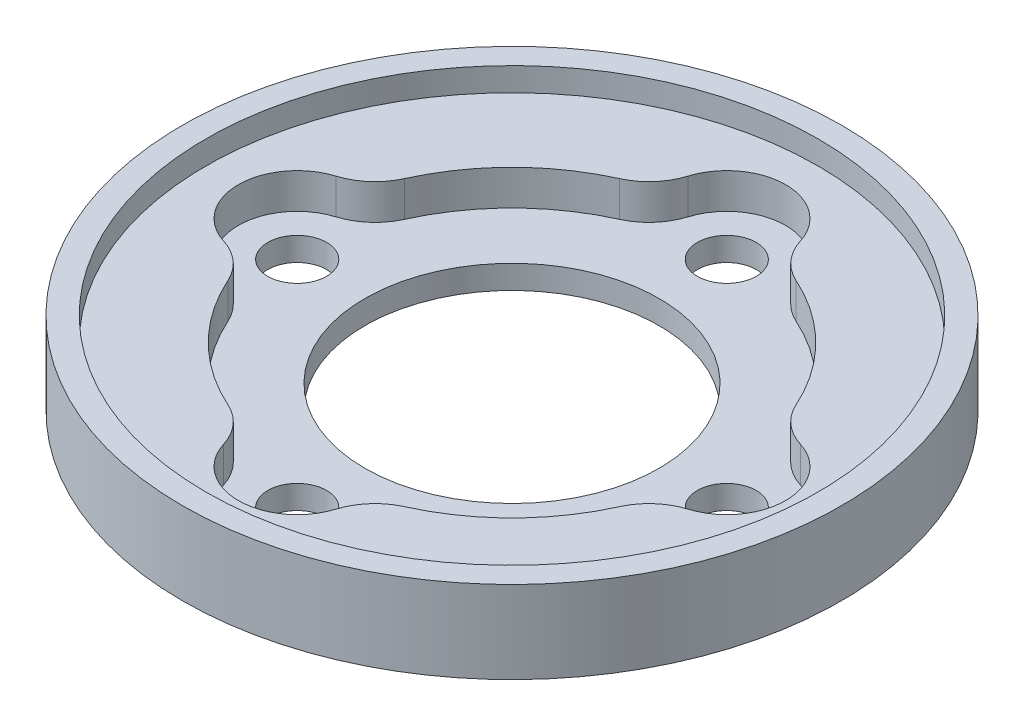
ISO-10303-21;
HEADER;
FILE_DESCRIPTION(('STEP AP214'),'2;1');
FILE_NAME('part.step','',(''),(''),'','','');
FILE_SCHEMA(('AUTOMOTIVE_DESIGN { 1 0 10303 214 1 1 1 1 }'));
ENDSEC;
DATA;
#1=APPLICATION_CONTEXT('core data for automotive mechanical design processes');
#2=APPLICATION_PROTOCOL_DEFINITION('international standard','automotive_design',2000,#1);
#3=PRODUCT_CONTEXT('',#1,'mechanical');
#4=PRODUCT('Part','Part','',(#3));
#5=PRODUCT_RELATED_PRODUCT_CATEGORY('part','',(#4));
#6=PRODUCT_DEFINITION_FORMATION('','',#4);
#7=PRODUCT_DEFINITION_CONTEXT('part definition',#1,'design');
#8=PRODUCT_DEFINITION('design','',#6,#7);
#9=PRODUCT_DEFINITION_SHAPE('','',#8);
#10=(LENGTH_UNIT() NAMED_UNIT(*) SI_UNIT(.MILLI.,.METRE.));
#11=(NAMED_UNIT(*) PLANE_ANGLE_UNIT() SI_UNIT($,.RADIAN.));
#12=(NAMED_UNIT(*) SI_UNIT($,.STERADIAN.) SOLID_ANGLE_UNIT());
#13=UNCERTAINTY_MEASURE_WITH_UNIT(LENGTH_MEASURE(1.E-05),#10,'distance_accuracy_value','');
#14=(GEOMETRIC_REPRESENTATION_CONTEXT(3) GLOBAL_UNCERTAINTY_ASSIGNED_CONTEXT((#13)) GLOBAL_UNIT_ASSIGNED_CONTEXT((#10,
#11,#12)) REPRESENTATION_CONTEXT('',''));
#15=CARTESIAN_POINT('',(0.,0.,0.));
#16=DIRECTION('',(0.,0.,1.));
#17=DIRECTION('',(1.,0.,0.));
#18=AXIS2_PLACEMENT_3D('',#15,#16,#17);
#19=CARTESIAN_POINT('',(0.,5.,0.));
#20=DIRECTION('',(0.,-1.,0.));
#21=DIRECTION('',(0.,0.,-1.));
#22=AXIS2_PLACEMENT_3D('',#19,#20,#21);
#23=CYLINDRICAL_SURFACE('',#22,12.5);
#24=CARTESIAN_POINT('',(0.,0.,0.));
#25=DIRECTION('',(0.,1.,0.));
#26=DIRECTION('',(0.,0.,1.));
#27=AXIS2_PLACEMENT_3D('',#24,#25,#26);
#28=CIRCLE('',#27,12.5);
#29=CARTESIAN_POINT('',(0.,0.,12.5));
#30=VERTEX_POINT('',#29);
#31=EDGE_CURVE('E255',#30,#30,#28,.T.);
#32=ORIENTED_EDGE('',*,*,#31,.F.);
#33=EDGE_LOOP('',(#32));
#34=FACE_BOUND('',#33,.T.);
#35=CARTESIAN_POINT('',(0.,2.,0.));
#36=DIRECTION('',(0.,1.,0.));
#37=DIRECTION('',(0.,0.,1.));
#38=AXIS2_PLACEMENT_3D('',#35,#36,#37);
#39=CIRCLE('',#38,12.5);
#40=CARTESIAN_POINT('',(0.,2.,12.5));
#41=VERTEX_POINT('',#40);
#42=EDGE_CURVE('E227',#41,#41,#39,.T.);
#43=ORIENTED_EDGE('',*,*,#42,.T.);
#44=EDGE_LOOP('',(#43));
#45=FACE_BOUND('',#44,.T.);
#46=ADVANCED_FACE('F39',(#34,#45),#23,.F.);
#47=CARTESIAN_POINT('',(18.25,5.,0.));
#48=DIRECTION('',(0.,-1.,0.));
#49=DIRECTION('',(0.,0.,-1.));
#50=AXIS2_PLACEMENT_3D('',#47,#48,#49);
#51=CYLINDRICAL_SURFACE('',#50,2.5);
#52=CARTESIAN_POINT('',(18.25,0.,0.));
#53=DIRECTION('',(0.,1.,0.));
#54=DIRECTION('',(0.,0.,1.));
#55=AXIS2_PLACEMENT_3D('',#52,#53,#54);
#56=CIRCLE('',#55,2.5);
#57=CARTESIAN_POINT('',(18.25,0.,2.5));
#58=VERTEX_POINT('',#57);
#59=EDGE_CURVE('E251',#58,#58,#56,.T.);
#60=ORIENTED_EDGE('',*,*,#59,.F.);
#61=EDGE_LOOP('',(#60));
#62=FACE_BOUND('',#61,.T.);
#63=CARTESIAN_POINT('',(18.25,2.,0.));
#64=DIRECTION('',(0.,1.,0.));
#65=DIRECTION('',(0.,0.,1.));
#66=AXIS2_PLACEMENT_3D('',#63,#64,#65);
#67=CIRCLE('',#66,2.5);
#68=CARTESIAN_POINT('',(18.25,2.,2.5));
#69=VERTEX_POINT('',#68);
#70=EDGE_CURVE('E223',#69,#69,#67,.T.);
#71=ORIENTED_EDGE('',*,*,#70,.T.);
#72=EDGE_LOOP('',(#71));
#73=FACE_BOUND('',#72,.T.);
#74=ADVANCED_FACE('F445',(#62,#73),#51,.F.);
#75=CARTESIAN_POINT('',(0.,5.,18.25));
#76=DIRECTION('',(0.,-1.,0.));
#77=DIRECTION('',(0.,0.,-1.));
#78=AXIS2_PLACEMENT_3D('',#75,#76,#77);
#79=CYLINDRICAL_SURFACE('',#78,2.5);
#80=CARTESIAN_POINT('',(0.,0.,18.25));
#81=DIRECTION('',(0.,1.,0.));
#82=DIRECTION('',(0.,0.,1.));
#83=AXIS2_PLACEMENT_3D('',#80,#81,#82);
#84=CIRCLE('',#83,2.5);
#85=CARTESIAN_POINT('',(0.,0.,20.75));
#86=VERTEX_POINT('',#85);
#87=EDGE_CURVE('E247',#86,#86,#84,.T.);
#88=ORIENTED_EDGE('',*,*,#87,.F.);
#89=EDGE_LOOP('',(#88));
#90=FACE_BOUND('',#89,.T.);
#91=CARTESIAN_POINT('',(0.,2.,18.25));
#92=DIRECTION('',(0.,1.,0.));
#93=DIRECTION('',(0.,0.,1.));
#94=AXIS2_PLACEMENT_3D('',#91,#92,#93);
#95=CIRCLE('',#94,2.5);
#96=CARTESIAN_POINT('',(0.,2.,20.75));
#97=VERTEX_POINT('',#96);
#98=EDGE_CURVE('E218',#97,#97,#95,.T.);
#99=ORIENTED_EDGE('',*,*,#98,.T.);
#100=EDGE_LOOP('',(#99));
#101=FACE_BOUND('',#100,.T.);
#102=ADVANCED_FACE('F451',(#90,#101),#79,.F.);
#103=CARTESIAN_POINT('',(-18.25,5.,-1.27439068867774E-13));
#104=DIRECTION('',(0.,-1.,0.));
#105=DIRECTION('',(0.,0.,-1.));
#106=AXIS2_PLACEMENT_3D('',#103,#104,#105);
#107=CYLINDRICAL_SURFACE('',#106,2.5);
#108=CARTESIAN_POINT('',(-18.25,0.,-1.27439068867774E-13));
#109=DIRECTION('',(0.,1.,0.));
#110=DIRECTION('',(0.,0.,1.));
#111=AXIS2_PLACEMENT_3D('',#108,#109,#110);
#112=CIRCLE('',#111,2.5);
#113=CARTESIAN_POINT('',(-18.25,0.,2.49999999999987));
#114=VERTEX_POINT('',#113);
#115=EDGE_CURVE('E243',#114,#114,#112,.T.);
#116=ORIENTED_EDGE('',*,*,#115,.F.);
#117=EDGE_LOOP('',(#116));
#118=FACE_BOUND('',#117,.T.);
#119=CARTESIAN_POINT('',(-18.25,2.,-1.27439068867774E-13));
#120=DIRECTION('',(0.,1.,0.));
#121=DIRECTION('',(0.,0.,1.));
#122=AXIS2_PLACEMENT_3D('',#119,#120,#121);
#123=CIRCLE('',#122,2.5);
#124=CARTESIAN_POINT('',(-18.25,2.,2.49999999999987));
#125=VERTEX_POINT('',#124);
#126=EDGE_CURVE('E214',#125,#125,#123,.T.);
#127=ORIENTED_EDGE('',*,*,#126,.T.);
#128=EDGE_LOOP('',(#127));
#129=FACE_BOUND('',#128,.T.);
#130=ADVANCED_FACE('F506',(#118,#129),#107,.F.);
#131=CARTESIAN_POINT('',(1.91158603301662E-13,5.,-18.25));
#132=DIRECTION('',(0.,-1.,0.));
#133=DIRECTION('',(0.,0.,-1.));
#134=AXIS2_PLACEMENT_3D('',#131,#132,#133);
#135=CYLINDRICAL_SURFACE('',#134,2.5);
#136=CARTESIAN_POINT('',(1.91158603301662E-13,0.,-18.25));
#137=DIRECTION('',(0.,1.,0.));
#138=DIRECTION('',(0.,0.,1.));
#139=AXIS2_PLACEMENT_3D('',#136,#137,#138);
#140=CIRCLE('',#139,2.5);
#141=CARTESIAN_POINT('',(1.91158603301662E-13,0.,-15.75));
#142=VERTEX_POINT('',#141);
#143=EDGE_CURVE('E239',#142,#142,#140,.T.);
#144=ORIENTED_EDGE('',*,*,#143,.F.);
#145=EDGE_LOOP('',(#144));
#146=FACE_BOUND('',#145,.T.);
#147=CARTESIAN_POINT('',(1.91158603301662E-13,2.,-18.25));
#148=DIRECTION('',(0.,1.,0.));
#149=DIRECTION('',(0.,0.,1.));
#150=AXIS2_PLACEMENT_3D('',#147,#148,#149);
#151=CIRCLE('',#150,2.5);
#152=CARTESIAN_POINT('',(1.91158603301662E-13,2.,-15.75));
#153=VERTEX_POINT('',#152);
#154=EDGE_CURVE('E219',#153,#153,#151,.T.);
#155=ORIENTED_EDGE('',*,*,#154,.T.);
#156=EDGE_LOOP('',(#155));
#157=FACE_BOUND('',#156,.T.);
#158=ADVANCED_FACE('F461',(#146,#157),#135,.F.);
#159=CARTESIAN_POINT('',(0.,5.,0.));
#160=DIRECTION('',(0.,1.,0.));
#161=DIRECTION('',(0.,0.,1.));
#162=AXIS2_PLACEMENT_3D('',#159,#160,#161);
#163=PLANE('',#162);
#164=CARTESIAN_POINT('',(0.,5.,18.25));
#165=DIRECTION('',(0.,1.,0.));
#166=DIRECTION('',(0.,0.,1.));
#167=AXIS2_PLACEMENT_3D('',#164,#165,#166);
#168=CIRCLE('',#167,5.);
#169=CARTESIAN_POINT('',(-4.77822573461657,5.,19.722602739726));
#170=VERTEX_POINT('',#169);
#171=CARTESIAN_POINT('',(4.77822573461643,5.,19.722602739726));
#172=VERTEX_POINT('',#171);
#173=EDGE_CURVE('E171',#170,#172,#168,.T.);
#174=ORIENTED_EDGE('',*,*,#173,.F.);
#175=CARTESIAN_POINT('',(-9.55645146923308,5.,21.195205479452));
#176=DIRECTION('',(0.,1.,0.));
#177=DIRECTION('',(0.,0.,1.));
#178=AXIS2_PLACEMENT_3D('',#175,#176,#177);
#179=CIRCLE('',#178,5.);
#180=CARTESIAN_POINT('',(-7.50130061563457,5.,16.6370967741935));
#181=VERTEX_POINT('',#180);
#182=EDGE_CURVE('E153',#170,#181,#179,.T.);
#183=ORIENTED_EDGE('',*,*,#182,.T.);
#184=CARTESIAN_POINT('',(0.,5.,0.));
#185=DIRECTION('',(0.,1.,0.));
#186=DIRECTION('',(0.,0.,1.));
#187=AXIS2_PLACEMENT_3D('',#184,#185,#186);
#188=CIRCLE('',#187,18.25);
#189=CARTESIAN_POINT('',(-16.6370967741936,5.,7.50130061563439));
#190=VERTEX_POINT('',#189);
#191=EDGE_CURVE('E185',#190,#181,#188,.T.);
#192=ORIENTED_EDGE('',*,*,#191,.F.);
#193=CARTESIAN_POINT('',(-21.1952054794521,5.,9.55645146923286));
#194=DIRECTION('',(0.,1.,0.));
#195=DIRECTION('',(0.,0.,1.));
#196=AXIS2_PLACEMENT_3D('',#193,#194,#195);
#197=CIRCLE('',#196,5.);
#198=CARTESIAN_POINT('',(-19.7226027397261,5.,4.77822573461636));
#199=VERTEX_POINT('',#198);
#200=EDGE_CURVE('E165',#190,#199,#197,.T.);
#201=ORIENTED_EDGE('',*,*,#200,.T.);
#202=CARTESIAN_POINT('',(-18.25,5.,-1.27439068867774E-13));
#203=DIRECTION('',(0.,1.,0.));
#204=DIRECTION('',(0.,0.,1.));
#205=AXIS2_PLACEMENT_3D('',#202,#203,#204);
#206=CIRCLE('',#205,5.);
#207=CARTESIAN_POINT('',(-19.722602739726,5.,-4.77822573461664));
#208=VERTEX_POINT('',#207);
#209=EDGE_CURVE('E209',#208,#199,#206,.T.);
#210=ORIENTED_EDGE('',*,*,#209,.F.);
#211=CARTESIAN_POINT('',(-21.195205479452,5.,-9.55645146923315));
#212=DIRECTION('',(0.,1.,0.));
#213=DIRECTION('',(0.,0.,1.));
#214=AXIS2_PLACEMENT_3D('',#211,#212,#213);
#215=CIRCLE('',#214,5.);
#216=CARTESIAN_POINT('',(-16.6370967741935,5.,-7.50130061563462));
#217=VERTEX_POINT('',#216);
#218=EDGE_CURVE('E176',#208,#217,#215,.T.);
#219=ORIENTED_EDGE('',*,*,#218,.T.);
#220=CARTESIAN_POINT('',(0.,5.,0.));
#221=DIRECTION('',(0.,1.,0.));
#222=DIRECTION('',(0.,0.,1.));
#223=AXIS2_PLACEMENT_3D('',#220,#221,#222);
#224=CIRCLE('',#223,18.25);
#225=CARTESIAN_POINT('',(-7.50130061563433,5.,-16.6370967741936));
#226=VERTEX_POINT('',#225);
#227=EDGE_CURVE('E206',#226,#217,#224,.T.);
#228=ORIENTED_EDGE('',*,*,#227,.F.);
#229=CARTESIAN_POINT('',(-9.55645146923278,5.,-21.1952054794521));
#230=DIRECTION('',(0.,1.,0.));
#231=DIRECTION('',(0.,0.,1.));
#232=AXIS2_PLACEMENT_3D('',#229,#230,#231);
#233=CIRCLE('',#232,5.);
#234=CARTESIAN_POINT('',(-4.7782257346163,5.,-19.7226027397261));
#235=VERTEX_POINT('',#234);
#236=EDGE_CURVE('E275',#226,#235,#233,.T.);
#237=ORIENTED_EDGE('',*,*,#236,.T.);
#238=CARTESIAN_POINT('',(1.91158603301662E-13,5.,-18.25));
#239=DIRECTION('',(0.,1.,0.));
#240=DIRECTION('',(0.,0.,1.));
#241=AXIS2_PLACEMENT_3D('',#238,#239,#240);
#242=CIRCLE('',#241,5.);
#243=CARTESIAN_POINT('',(4.77822573461671,5.,-19.722602739726));
#244=VERTEX_POINT('',#243);
#245=EDGE_CURVE('E202',#244,#235,#242,.T.);
#246=ORIENTED_EDGE('',*,*,#245,.F.);
#247=CARTESIAN_POINT('',(9.55645146923323,5.,-21.1952054794519));
#248=DIRECTION('',(0.,1.,0.));
#249=DIRECTION('',(0.,0.,1.));
#250=AXIS2_PLACEMENT_3D('',#247,#248,#249);
#251=CIRCLE('',#250,5.);
#252=CARTESIAN_POINT('',(7.50130061563468,5.,-16.6370967741935));
#253=VERTEX_POINT('',#252);
#254=EDGE_CURVE('E278',#244,#253,#251,.T.);
#255=ORIENTED_EDGE('',*,*,#254,.T.);
#256=CARTESIAN_POINT('',(0.,5.,0.));
#257=DIRECTION('',(0.,1.,0.));
#258=DIRECTION('',(0.,0.,1.));
#259=AXIS2_PLACEMENT_3D('',#256,#257,#258);
#260=CIRCLE('',#259,18.25);
#261=CARTESIAN_POINT('',(16.6370967741935,5.,-7.50130061563451));
#262=VERTEX_POINT('',#261);
#263=EDGE_CURVE('E198',#262,#253,#260,.T.);
#264=ORIENTED_EDGE('',*,*,#263,.F.);
#265=CARTESIAN_POINT('',(21.195205479452,5.,-9.55645146923301));
#266=DIRECTION('',(0.,1.,0.));
#267=DIRECTION('',(0.,0.,1.));
#268=AXIS2_PLACEMENT_3D('',#265,#266,#267);
#269=CIRCLE('',#268,5.);
#270=CARTESIAN_POINT('',(19.722602739726,5.,-4.7782257346165));
#271=VERTEX_POINT('',#270);
#272=EDGE_CURVE('E281',#262,#271,#269,.T.);
#273=ORIENTED_EDGE('',*,*,#272,.T.);
#274=CARTESIAN_POINT('',(18.25,5.,0.));
#275=DIRECTION('',(0.,1.,0.));
#276=DIRECTION('',(0.,0.,1.));
#277=AXIS2_PLACEMENT_3D('',#274,#275,#276);
#278=CIRCLE('',#277,5.);
#279=CARTESIAN_POINT('',(19.722602739726,5.,4.7782257346165));
#280=VERTEX_POINT('',#279);
#281=EDGE_CURVE('E190',#280,#271,#278,.T.);
#282=ORIENTED_EDGE('',*,*,#281,.F.);
#283=CARTESIAN_POINT('',(21.195205479452,5.,9.556451469233));
#284=DIRECTION('',(0.,1.,0.));
#285=DIRECTION('',(0.,0.,1.));
#286=AXIS2_PLACEMENT_3D('',#283,#284,#285);
#287=CIRCLE('',#286,5.);
#288=CARTESIAN_POINT('',(16.6370967741935,5.,7.5013006156345));
#289=VERTEX_POINT('',#288);
#290=EDGE_CURVE('E284',#280,#289,#287,.T.);
#291=ORIENTED_EDGE('',*,*,#290,.T.);
#292=CARTESIAN_POINT('',(0.,5.,0.));
#293=DIRECTION('',(0.,1.,0.));
#294=DIRECTION('',(0.,0.,1.));
#295=AXIS2_PLACEMENT_3D('',#292,#293,#294);
#296=CIRCLE('',#295,18.25);
#297=CARTESIAN_POINT('',(7.50130061563445,5.,16.6370967741936));
#298=VERTEX_POINT('',#297);
#299=EDGE_CURVE('E184',#298,#289,#296,.T.);
#300=ORIENTED_EDGE('',*,*,#299,.F.);
#301=CARTESIAN_POINT('',(9.55645146923293,5.,21.1952054794521));
#302=DIRECTION('',(0.,1.,0.));
#303=DIRECTION('',(0.,0.,1.));
#304=AXIS2_PLACEMENT_3D('',#301,#302,#303);
#305=CIRCLE('',#304,5.);
#306=EDGE_CURVE('E182',#298,#172,#305,.T.);
#307=ORIENTED_EDGE('',*,*,#306,.T.);
#308=EDGE_LOOP('',(#174,#183,#192,#201,#210,#219,#228,#237,#246,#255,#264,#273,#282,#291,#300,#307));
#309=FACE_BOUND('',#308,.T.);
#310=CARTESIAN_POINT('',(0.,5.,0.));
#311=DIRECTION('',(0.,1.,0.));
#312=DIRECTION('',(0.,0.,1.));
#313=AXIS2_PLACEMENT_3D('',#310,#311,#312);
#314=CIRCLE('',#313,26.);
#315=CARTESIAN_POINT('',(0.,5.,26.));
#316=VERTEX_POINT('',#315);
#317=EDGE_CURVE('E263',#316,#316,#314,.F.);
#318=ORIENTED_EDGE('',*,*,#317,.F.);
#319=EDGE_LOOP('',(#318));
#320=FACE_BOUND('',#319,.T.);
#321=ADVANCED_FACE('F179',(#309,#320),#163,.T.);
#322=CARTESIAN_POINT('',(0.,0.,0.));
#323=DIRECTION('',(0.,1.,0.));
#324=DIRECTION('',(0.,0.,1.));
#325=AXIS2_PLACEMENT_3D('',#322,#323,#324);
#326=PLANE('',#325);
#327=CARTESIAN_POINT('',(0.,0.,0.));
#328=DIRECTION('',(0.,1.,0.));
#329=DIRECTION('',(0.,0.,1.));
#330=AXIS2_PLACEMENT_3D('',#327,#328,#329);
#331=CIRCLE('',#330,28.);
#332=CARTESIAN_POINT('',(0.,0.,28.));
#333=VERTEX_POINT('',#332);
#334=EDGE_CURVE('E259',#333,#333,#331,.T.);
#335=ORIENTED_EDGE('',*,*,#334,.F.);
#336=EDGE_LOOP('',(#335));
#337=FACE_BOUND('',#336,.T.);
#338=ORIENTED_EDGE('',*,*,#31,.T.);
#339=EDGE_LOOP('',(#338));
#340=FACE_BOUND('',#339,.T.);
#341=ORIENTED_EDGE('',*,*,#59,.T.);
#342=EDGE_LOOP('',(#341));
#343=FACE_BOUND('',#342,.T.);
#344=ORIENTED_EDGE('',*,*,#87,.T.);
#345=EDGE_LOOP('',(#344));
#346=FACE_BOUND('',#345,.T.);
#347=ORIENTED_EDGE('',*,*,#115,.T.);
#348=EDGE_LOOP('',(#347));
#349=FACE_BOUND('',#348,.T.);
#350=ORIENTED_EDGE('',*,*,#143,.T.);
#351=EDGE_LOOP('',(#350));
#352=FACE_BOUND('',#351,.T.);
#353=ADVANCED_FACE('F460',(#337,#340,#343,#346,#349,#352),#326,.F.);
#354=CARTESIAN_POINT('',(0.,5.,0.));
#355=DIRECTION('',(0.,-1.,0.));
#356=DIRECTION('',(0.,0.,-1.));
#357=AXIS2_PLACEMENT_3D('',#354,#355,#356);
#358=CYLINDRICAL_SURFACE('',#357,28.);
#359=ORIENTED_EDGE('',*,*,#334,.T.);
#360=EDGE_LOOP('',(#359));
#361=FACE_BOUND('',#360,.T.);
#362=CARTESIAN_POINT('',(0.,7.,0.));
#363=DIRECTION('',(0.,1.,0.));
#364=DIRECTION('',(0.,0.,1.));
#365=AXIS2_PLACEMENT_3D('',#362,#363,#364);
#366=CIRCLE('',#365,28.);
#367=CARTESIAN_POINT('',(0.,7.,28.));
#368=VERTEX_POINT('',#367);
#369=EDGE_CURVE('E235',#368,#368,#366,.T.);
#370=ORIENTED_EDGE('',*,*,#369,.F.);
#371=EDGE_LOOP('',(#370));
#372=FACE_BOUND('',#371,.T.);
#373=ADVANCED_FACE('F464',(#361,#372),#358,.T.);
#374=CARTESIAN_POINT('',(0.,7.,0.));
#375=DIRECTION('',(0.,1.,0.));
#376=DIRECTION('',(0.,0.,1.));
#377=AXIS2_PLACEMENT_3D('',#374,#375,#376);
#378=PLANE('',#377);
#379=ORIENTED_EDGE('',*,*,#369,.T.);
#380=EDGE_LOOP('',(#379));
#381=FACE_BOUND('',#380,.T.);
#382=CARTESIAN_POINT('',(0.,7.,0.));
#383=DIRECTION('',(0.,1.,0.));
#384=DIRECTION('',(0.,0.,1.));
#385=AXIS2_PLACEMENT_3D('',#382,#383,#384);
#386=CIRCLE('',#385,26.);
#387=CARTESIAN_POINT('',(0.,7.,26.));
#388=VERTEX_POINT('',#387);
#389=EDGE_CURVE('E231',#388,#388,#386,.T.);
#390=ORIENTED_EDGE('',*,*,#389,.F.);
#391=EDGE_LOOP('',(#390));
#392=FACE_BOUND('',#391,.T.);
#393=ADVANCED_FACE('F468',(#381,#392),#378,.T.);
#394=CARTESIAN_POINT('',(0.,7.,0.));
#395=DIRECTION('',(0.,-1.,0.));
#396=DIRECTION('',(0.,0.,-1.));
#397=AXIS2_PLACEMENT_3D('',#394,#395,#396);
#398=CYLINDRICAL_SURFACE('',#397,26.);
#399=ORIENTED_EDGE('',*,*,#389,.T.);
#400=EDGE_LOOP('',(#399));
#401=FACE_BOUND('',#400,.T.);
#402=ORIENTED_EDGE('',*,*,#317,.T.);
#403=EDGE_LOOP('',(#402));
#404=FACE_BOUND('',#403,.T.);
#405=ADVANCED_FACE('F497',(#401,#404),#398,.F.);
#406=CARTESIAN_POINT('',(0.,2.,0.));
#407=DIRECTION('',(0.,1.,0.));
#408=DIRECTION('',(0.,0.,1.));
#409=AXIS2_PLACEMENT_3D('',#406,#407,#408);
#410=CYLINDRICAL_SURFACE('',#409,18.25);
#411=ORIENTED_EDGE('',*,*,#191,.T.);
#412=DIRECTION('',(0.,1.,0.));
#413=VECTOR('',#412,1.);
#414=CARTESIAN_POINT('',(-7.50130061563457,2.,16.6370967741935));
#415=LINE('',#414,#413);
#416=CARTESIAN_POINT('',(-7.50130061563457,2.,16.6370967741935));
#417=VERTEX_POINT('',#416);
#418=EDGE_CURVE('E158',#181,#417,#415,.F.);
#419=ORIENTED_EDGE('',*,*,#418,.T.);
#420=CARTESIAN_POINT('',(0.,2.,0.));
#421=DIRECTION('',(0.,1.,0.));
#422=DIRECTION('',(0.,0.,1.));
#423=AXIS2_PLACEMENT_3D('',#420,#421,#422);
#424=CIRCLE('',#423,18.25);
#425=CARTESIAN_POINT('',(-16.6370967741936,2.,7.50130061563439));
#426=VERTEX_POINT('',#425);
#427=EDGE_CURVE('E213',#426,#417,#424,.T.);
#428=ORIENTED_EDGE('',*,*,#427,.F.);
#429=DIRECTION('',(0.,1.,0.));
#430=VECTOR('',#429,1.);
#431=CARTESIAN_POINT('',(-16.6370967741936,2.,7.50130061563439));
#432=LINE('',#431,#430);
#433=EDGE_CURVE('E164',#426,#190,#432,.T.);
#434=ORIENTED_EDGE('',*,*,#433,.T.);
#435=EDGE_LOOP('',(#411,#419,#428,#434));
#436=FACE_BOUND('',#435,.T.);
#437=ADVANCED_FACE('F385',(#436),#410,.F.);
#438=CARTESIAN_POINT('',(-18.25,2.,-1.27439068867774E-13));
#439=DIRECTION('',(0.,1.,0.));
#440=DIRECTION('',(0.,0.,1.));
#441=AXIS2_PLACEMENT_3D('',#438,#439,#440);
#442=CYLINDRICAL_SURFACE('',#441,5.);
#443=ORIENTED_EDGE('',*,*,#209,.T.);
#444=DIRECTION('',(0.,1.,0.));
#445=VECTOR('',#444,1.);
#446=CARTESIAN_POINT('',(-19.7226027397261,2.,4.77822573461636));
#447=LINE('',#446,#445);
#448=CARTESIAN_POINT('',(-19.7226027397261,2.,4.77822573461636));
#449=VERTEX_POINT('',#448);
#450=EDGE_CURVE('E300',#199,#449,#447,.F.);
#451=ORIENTED_EDGE('',*,*,#450,.T.);
#452=CARTESIAN_POINT('',(-18.25,2.,-1.27439068867774E-13));
#453=DIRECTION('',(0.,1.,0.));
#454=DIRECTION('',(0.,0.,1.));
#455=AXIS2_PLACEMENT_3D('',#452,#453,#454);
#456=CIRCLE('',#455,5.);
#457=CARTESIAN_POINT('',(-19.722602739726,2.,-4.77822573461664));
#458=VERTEX_POINT('',#457);
#459=EDGE_CURVE('E270',#458,#449,#456,.T.);
#460=ORIENTED_EDGE('',*,*,#459,.F.);
#461=DIRECTION('',(0.,1.,0.));
#462=VECTOR('',#461,1.);
#463=CARTESIAN_POINT('',(-19.722602739726,2.,-4.77822573461664));
#464=LINE('',#463,#462);
#465=EDGE_CURVE('E296',#458,#208,#464,.T.);
#466=ORIENTED_EDGE('',*,*,#465,.T.);
#467=EDGE_LOOP('',(#443,#451,#460,#466));
#468=FACE_BOUND('',#467,.T.);
#469=ADVANCED_FACE('F391',(#468),#442,.F.);
#470=CARTESIAN_POINT('',(0.,2.,0.));
#471=DIRECTION('',(0.,1.,0.));
#472=DIRECTION('',(0.,0.,1.));
#473=AXIS2_PLACEMENT_3D('',#470,#471,#472);
#474=CYLINDRICAL_SURFACE('',#473,18.25);
#475=CARTESIAN_POINT('',(0.,2.,0.));
#476=DIRECTION('',(0.,1.,0.));
#477=DIRECTION('',(0.,0.,1.));
#478=AXIS2_PLACEMENT_3D('',#475,#476,#477);
#479=CIRCLE('',#478,18.25);
#480=CARTESIAN_POINT('',(-7.50130061563433,2.,-16.6370967741936));
#481=VERTEX_POINT('',#480);
#482=CARTESIAN_POINT('',(-16.6370967741935,2.,-7.50130061563462));
#483=VERTEX_POINT('',#482);
#484=EDGE_CURVE('E358',#481,#483,#479,.T.);
#485=ORIENTED_EDGE('',*,*,#484,.F.);
#486=DIRECTION('',(0.,1.,0.));
#487=VECTOR('',#486,1.);
#488=CARTESIAN_POINT('',(-7.50130061563434,2.,-16.6370967741936));
#489=LINE('',#488,#487);
#490=EDGE_CURVE('E333',#481,#226,#489,.T.);
#491=ORIENTED_EDGE('',*,*,#490,.T.);
#492=ORIENTED_EDGE('',*,*,#227,.T.);
#493=DIRECTION('',(0.,1.,0.));
#494=VECTOR('',#493,1.);
#495=CARTESIAN_POINT('',(-16.6370967741935,2.,-7.50130061563462));
#496=LINE('',#495,#494);
#497=EDGE_CURVE('E55',#217,#483,#496,.F.);
#498=ORIENTED_EDGE('',*,*,#497,.T.);
#499=EDGE_LOOP('',(#485,#491,#492,#498));
#500=FACE_BOUND('',#499,.T.);
#501=ADVANCED_FACE('F397',(#500),#474,.F.);
#502=CARTESIAN_POINT('',(1.91158603301662E-13,2.,-18.25));
#503=DIRECTION('',(0.,1.,0.));
#504=DIRECTION('',(0.,0.,1.));
#505=AXIS2_PLACEMENT_3D('',#502,#503,#504);
#506=CYLINDRICAL_SURFACE('',#505,5.);
#507=CARTESIAN_POINT('',(1.91158603301662E-13,2.,-18.25));
#508=DIRECTION('',(0.,1.,0.));
#509=DIRECTION('',(0.,0.,1.));
#510=AXIS2_PLACEMENT_3D('',#507,#508,#509);
#511=CIRCLE('',#510,5.);
#512=CARTESIAN_POINT('',(4.77822573461671,2.,-19.722602739726));
#513=VERTEX_POINT('',#512);
#514=CARTESIAN_POINT('',(-4.7782257346163,2.,-19.7226027397261));
#515=VERTEX_POINT('',#514);
#516=EDGE_CURVE('E360',#513,#515,#511,.T.);
#517=ORIENTED_EDGE('',*,*,#516,.F.);
#518=DIRECTION('',(0.,1.,0.));
#519=VECTOR('',#518,1.);
#520=CARTESIAN_POINT('',(4.77822573461671,2.,-19.722602739726));
#521=LINE('',#520,#519);
#522=EDGE_CURVE('E327',#513,#244,#521,.T.);
#523=ORIENTED_EDGE('',*,*,#522,.T.);
#524=ORIENTED_EDGE('',*,*,#245,.T.);
#525=DIRECTION('',(0.,1.,0.));
#526=VECTOR('',#525,1.);
#527=CARTESIAN_POINT('',(-4.7782257346163,2.,-19.7226027397261));
#528=LINE('',#527,#526);
#529=EDGE_CURVE('E324',#235,#515,#528,.F.);
#530=ORIENTED_EDGE('',*,*,#529,.T.);
#531=EDGE_LOOP('',(#517,#523,#524,#530));
#532=FACE_BOUND('',#531,.T.);
#533=ADVANCED_FACE('F405',(#532),#506,.F.);
#534=CARTESIAN_POINT('',(0.,2.,0.));
#535=DIRECTION('',(0.,1.,0.));
#536=DIRECTION('',(0.,0.,1.));
#537=AXIS2_PLACEMENT_3D('',#534,#535,#536);
#538=CYLINDRICAL_SURFACE('',#537,18.25);
#539=CARTESIAN_POINT('',(0.,2.,0.));
#540=DIRECTION('',(0.,1.,0.));
#541=DIRECTION('',(0.,0.,1.));
#542=AXIS2_PLACEMENT_3D('',#539,#540,#541);
#543=CIRCLE('',#542,18.25);
#544=CARTESIAN_POINT('',(16.6370967741935,2.,-7.50130061563451));
#545=VERTEX_POINT('',#544);
#546=CARTESIAN_POINT('',(7.50130061563468,2.,-16.6370967741935));
#547=VERTEX_POINT('',#546);
#548=EDGE_CURVE('E363',#545,#547,#543,.T.);
#549=ORIENTED_EDGE('',*,*,#548,.F.);
#550=DIRECTION('',(0.,1.,0.));
#551=VECTOR('',#550,1.);
#552=CARTESIAN_POINT('',(16.6370967741935,2.,-7.50130061563451));
#553=LINE('',#552,#551);
#554=EDGE_CURVE('E320',#545,#262,#553,.T.);
#555=ORIENTED_EDGE('',*,*,#554,.T.);
#556=ORIENTED_EDGE('',*,*,#263,.T.);
#557=DIRECTION('',(0.,1.,0.));
#558=VECTOR('',#557,1.);
#559=CARTESIAN_POINT('',(7.50130061563469,2.,-16.6370967741935));
#560=LINE('',#559,#558);
#561=EDGE_CURVE('E317',#253,#547,#560,.F.);
#562=ORIENTED_EDGE('',*,*,#561,.T.);
#563=EDGE_LOOP('',(#549,#555,#556,#562));
#564=FACE_BOUND('',#563,.T.);
#565=ADVANCED_FACE('F414',(#564),#538,.F.);
#566=CARTESIAN_POINT('',(18.25,2.,0.));
#567=DIRECTION('',(0.,1.,0.));
#568=DIRECTION('',(0.,0.,1.));
#569=AXIS2_PLACEMENT_3D('',#566,#567,#568);
#570=CYLINDRICAL_SURFACE('',#569,5.);
#571=CARTESIAN_POINT('',(18.25,2.,0.));
#572=DIRECTION('',(0.,1.,0.));
#573=DIRECTION('',(0.,0.,1.));
#574=AXIS2_PLACEMENT_3D('',#571,#572,#573);
#575=CIRCLE('',#574,5.);
#576=CARTESIAN_POINT('',(19.722602739726,2.,4.7782257346165));
#577=VERTEX_POINT('',#576);
#578=CARTESIAN_POINT('',(19.722602739726,2.,-4.7782257346165));
#579=VERTEX_POINT('',#578);
#580=EDGE_CURVE('E367',#577,#579,#575,.T.);
#581=ORIENTED_EDGE('',*,*,#580,.F.);
#582=DIRECTION('',(0.,1.,0.));
#583=VECTOR('',#582,1.);
#584=CARTESIAN_POINT('',(19.722602739726,2.,4.7782257346165));
#585=LINE('',#584,#583);
#586=EDGE_CURVE('E313',#577,#280,#585,.T.);
#587=ORIENTED_EDGE('',*,*,#586,.T.);
#588=ORIENTED_EDGE('',*,*,#281,.T.);
#589=DIRECTION('',(0.,1.,0.));
#590=VECTOR('',#589,1.);
#591=CARTESIAN_POINT('',(19.722602739726,2.,-4.7782257346165));
#592=LINE('',#591,#590);
#593=EDGE_CURVE('E310',#271,#579,#592,.F.);
#594=ORIENTED_EDGE('',*,*,#593,.T.);
#595=EDGE_LOOP('',(#581,#587,#588,#594));
#596=FACE_BOUND('',#595,.T.);
#597=ADVANCED_FACE('F423',(#596),#570,.F.);
#598=CARTESIAN_POINT('',(0.,2.,0.));
#599=DIRECTION('',(0.,1.,0.));
#600=DIRECTION('',(0.,0.,1.));
#601=AXIS2_PLACEMENT_3D('',#598,#599,#600);
#602=CYLINDRICAL_SURFACE('',#601,18.25);
#603=CARTESIAN_POINT('',(0.,2.,0.));
#604=DIRECTION('',(0.,1.,0.));
#605=DIRECTION('',(0.,0.,1.));
#606=AXIS2_PLACEMENT_3D('',#603,#604,#605);
#607=CIRCLE('',#606,18.25);
#608=CARTESIAN_POINT('',(7.50130061563445,2.,16.6370967741936));
#609=VERTEX_POINT('',#608);
#610=CARTESIAN_POINT('',(16.6370967741935,2.,7.5013006156345));
#611=VERTEX_POINT('',#610);
#612=EDGE_CURVE('E371',#609,#611,#607,.T.);
#613=ORIENTED_EDGE('',*,*,#612,.F.);
#614=DIRECTION('',(0.,1.,0.));
#615=VECTOR('',#614,1.);
#616=CARTESIAN_POINT('',(7.50130061563445,2.,16.6370967741936));
#617=LINE('',#616,#615);
#618=EDGE_CURVE('E306',#609,#298,#617,.T.);
#619=ORIENTED_EDGE('',*,*,#618,.T.);
#620=ORIENTED_EDGE('',*,*,#299,.T.);
#621=DIRECTION('',(0.,1.,0.));
#622=VECTOR('',#621,1.);
#623=CARTESIAN_POINT('',(16.6370967741935,2.,7.5013006156345));
#624=LINE('',#623,#622);
#625=EDGE_CURVE('E303',#289,#611,#624,.F.);
#626=ORIENTED_EDGE('',*,*,#625,.T.);
#627=EDGE_LOOP('',(#613,#619,#620,#626));
#628=FACE_BOUND('',#627,.T.);
#629=ADVANCED_FACE('F431',(#628),#602,.F.);
#630=CARTESIAN_POINT('',(0.,2.,18.25));
#631=DIRECTION('',(0.,1.,0.));
#632=DIRECTION('',(0.,0.,1.));
#633=AXIS2_PLACEMENT_3D('',#630,#631,#632);
#634=CYLINDRICAL_SURFACE('',#633,5.);
#635=CARTESIAN_POINT('',(0.,2.,18.25));
#636=DIRECTION('',(0.,1.,0.));
#637=DIRECTION('',(0.,0.,1.));
#638=AXIS2_PLACEMENT_3D('',#635,#636,#637);
#639=CIRCLE('',#638,5.);
#640=CARTESIAN_POINT('',(-4.77822573461657,2.,19.722602739726));
#641=VERTEX_POINT('',#640);
#642=CARTESIAN_POINT('',(4.77822573461643,2.,19.722602739726));
#643=VERTEX_POINT('',#642);
#644=EDGE_CURVE('E174',#641,#643,#639,.T.);
#645=ORIENTED_EDGE('',*,*,#644,.F.);
#646=DIRECTION('',(0.,1.,0.));
#647=VECTOR('',#646,1.);
#648=CARTESIAN_POINT('',(-4.77822573461657,2.,19.722602739726));
#649=LINE('',#648,#647);
#650=EDGE_CURVE('E157',#641,#170,#649,.T.);
#651=ORIENTED_EDGE('',*,*,#650,.T.);
#652=ORIENTED_EDGE('',*,*,#173,.T.);
#653=DIRECTION('',(0.,1.,0.));
#654=VECTOR('',#653,1.);
#655=CARTESIAN_POINT('',(4.77822573461643,2.,19.722602739726));
#656=LINE('',#655,#654);
#657=EDGE_CURVE('E177',#172,#643,#656,.F.);
#658=ORIENTED_EDGE('',*,*,#657,.T.);
#659=EDGE_LOOP('',(#645,#651,#652,#658));
#660=FACE_BOUND('',#659,.T.);
#661=ADVANCED_FACE('F170',(#660),#634,.F.);
#662=CARTESIAN_POINT('',(0.,2.,9.125));
#663=DIRECTION('',(0.,1.,0.));
#664=DIRECTION('',(0.,0.,1.));
#665=AXIS2_PLACEMENT_3D('',#662,#663,#664);
#666=PLANE('',#665);
#667=ORIENTED_EDGE('',*,*,#42,.F.);
#668=EDGE_LOOP('',(#667));
#669=FACE_BOUND('',#668,.T.);
#670=ORIENTED_EDGE('',*,*,#70,.F.);
#671=EDGE_LOOP('',(#670));
#672=FACE_BOUND('',#671,.T.);
#673=ORIENTED_EDGE('',*,*,#98,.F.);
#674=EDGE_LOOP('',(#673));
#675=FACE_BOUND('',#674,.T.);
#676=ORIENTED_EDGE('',*,*,#126,.F.);
#677=EDGE_LOOP('',(#676));
#678=FACE_BOUND('',#677,.T.);
#679=ORIENTED_EDGE('',*,*,#154,.F.);
#680=EDGE_LOOP('',(#679));
#681=FACE_BOUND('',#680,.T.);
#682=ORIENTED_EDGE('',*,*,#459,.T.);
#683=CARTESIAN_POINT('',(-21.1952054794521,2.,9.55645146923286));
#684=DIRECTION('',(0.,1.,0.));
#685=DIRECTION('',(0.,0.,1.));
#686=AXIS2_PLACEMENT_3D('',#683,#684,#685);
#687=CIRCLE('',#686,5.);
#688=EDGE_CURVE('E340',#449,#426,#687,.F.);
#689=ORIENTED_EDGE('',*,*,#688,.T.);
#690=ORIENTED_EDGE('',*,*,#427,.T.);
#691=CARTESIAN_POINT('',(-9.55645146923308,2.,21.195205479452));
#692=DIRECTION('',(0.,1.,0.));
#693=DIRECTION('',(0.,0.,1.));
#694=AXIS2_PLACEMENT_3D('',#691,#692,#693);
#695=CIRCLE('',#694,5.);
#696=EDGE_CURVE('E337',#417,#641,#695,.F.);
#697=ORIENTED_EDGE('',*,*,#696,.T.);
#698=ORIENTED_EDGE('',*,*,#644,.T.);
#699=CARTESIAN_POINT('',(9.55645146923293,2.,21.1952054794521));
#700=DIRECTION('',(0.,1.,0.));
#701=DIRECTION('',(0.,0.,1.));
#702=AXIS2_PLACEMENT_3D('',#699,#700,#701);
#703=CIRCLE('',#702,5.);
#704=EDGE_CURVE('E343',#643,#609,#703,.F.);
#705=ORIENTED_EDGE('',*,*,#704,.T.);
#706=ORIENTED_EDGE('',*,*,#612,.T.);
#707=CARTESIAN_POINT('',(21.195205479452,2.,9.556451469233));
#708=DIRECTION('',(0.,1.,0.));
#709=DIRECTION('',(0.,0.,1.));
#710=AXIS2_PLACEMENT_3D('',#707,#708,#709);
#711=CIRCLE('',#710,5.);
#712=EDGE_CURVE('E346',#611,#577,#711,.F.);
#713=ORIENTED_EDGE('',*,*,#712,.T.);
#714=ORIENTED_EDGE('',*,*,#580,.T.);
#715=CARTESIAN_POINT('',(21.195205479452,2.,-9.55645146923301));
#716=DIRECTION('',(0.,1.,0.));
#717=DIRECTION('',(0.,0.,1.));
#718=AXIS2_PLACEMENT_3D('',#715,#716,#717);
#719=CIRCLE('',#718,5.);
#720=EDGE_CURVE('E349',#579,#545,#719,.F.);
#721=ORIENTED_EDGE('',*,*,#720,.T.);
#722=ORIENTED_EDGE('',*,*,#548,.T.);
#723=CARTESIAN_POINT('',(9.55645146923323,2.,-21.1952054794519));
#724=DIRECTION('',(0.,1.,0.));
#725=DIRECTION('',(0.,0.,1.));
#726=AXIS2_PLACEMENT_3D('',#723,#724,#725);
#727=CIRCLE('',#726,5.);
#728=EDGE_CURVE('E352',#547,#513,#727,.F.);
#729=ORIENTED_EDGE('',*,*,#728,.T.);
#730=ORIENTED_EDGE('',*,*,#516,.T.);
#731=CARTESIAN_POINT('',(-9.55645146923278,2.,-21.1952054794521));
#732=DIRECTION('',(0.,1.,0.));
#733=DIRECTION('',(0.,0.,1.));
#734=AXIS2_PLACEMENT_3D('',#731,#732,#733);
#735=CIRCLE('',#734,5.);
#736=EDGE_CURVE('E48',#515,#481,#735,.F.);
#737=ORIENTED_EDGE('',*,*,#736,.T.);
#738=ORIENTED_EDGE('',*,*,#484,.T.);
#739=CARTESIAN_POINT('',(-21.195205479452,2.,-9.55645146923315));
#740=DIRECTION('',(0.,1.,0.));
#741=DIRECTION('',(0.,0.,1.));
#742=AXIS2_PLACEMENT_3D('',#739,#740,#741);
#743=CIRCLE('',#742,5.);
#744=EDGE_CURVE('E11',#483,#458,#743,.F.);
#745=ORIENTED_EDGE('',*,*,#744,.T.);
#746=EDGE_LOOP('',(#682,#689,#690,#697,#698,#705,#706,#713,#714,#721,#722,#729,#730,#737,#738,#745));
#747=FACE_BOUND('',#746,.T.);
#748=ADVANCED_FACE('F381',(#669,#672,#675,#678,#681,#747),#666,.T.);
#749=CARTESIAN_POINT('',(-9.55645146923308,2.,21.195205479452));
#750=DIRECTION('',(0.,1.,0.));
#751=DIRECTION('',(0.,0.,1.));
#752=AXIS2_PLACEMENT_3D('',#749,#750,#751);
#753=CYLINDRICAL_SURFACE('',#752,5.);
#754=ORIENTED_EDGE('',*,*,#696,.F.);
#755=ORIENTED_EDGE('',*,*,#418,.F.);
#756=ORIENTED_EDGE('',*,*,#182,.F.);
#757=ORIENTED_EDGE('',*,*,#650,.F.);
#758=EDGE_LOOP('',(#754,#755,#756,#757));
#759=FACE_BOUND('',#758,.T.);
#760=ADVANCED_FACE('F156',(#759),#753,.T.);
#761=CARTESIAN_POINT('',(-21.1952054794521,2.,9.55645146923286));
#762=DIRECTION('',(0.,1.,0.));
#763=DIRECTION('',(0.,0.,1.));
#764=AXIS2_PLACEMENT_3D('',#761,#762,#763);
#765=CYLINDRICAL_SURFACE('',#764,5.);
#766=ORIENTED_EDGE('',*,*,#688,.F.);
#767=ORIENTED_EDGE('',*,*,#450,.F.);
#768=ORIENTED_EDGE('',*,*,#200,.F.);
#769=ORIENTED_EDGE('',*,*,#433,.F.);
#770=EDGE_LOOP('',(#766,#767,#768,#769));
#771=FACE_BOUND('',#770,.T.);
#772=ADVANCED_FACE('F387',(#771),#765,.T.);
#773=CARTESIAN_POINT('',(9.55645146923293,2.,21.1952054794521));
#774=DIRECTION('',(0.,1.,0.));
#775=DIRECTION('',(0.,0.,1.));
#776=AXIS2_PLACEMENT_3D('',#773,#774,#775);
#777=CYLINDRICAL_SURFACE('',#776,5.);
#778=ORIENTED_EDGE('',*,*,#704,.F.);
#779=ORIENTED_EDGE('',*,*,#657,.F.);
#780=ORIENTED_EDGE('',*,*,#306,.F.);
#781=ORIENTED_EDGE('',*,*,#618,.F.);
#782=EDGE_LOOP('',(#778,#779,#780,#781));
#783=FACE_BOUND('',#782,.T.);
#784=ADVANCED_FACE('F435',(#783),#777,.T.);
#785=CARTESIAN_POINT('',(21.195205479452,2.,9.556451469233));
#786=DIRECTION('',(0.,1.,0.));
#787=DIRECTION('',(0.,0.,1.));
#788=AXIS2_PLACEMENT_3D('',#785,#786,#787);
#789=CYLINDRICAL_SURFACE('',#788,5.);
#790=ORIENTED_EDGE('',*,*,#712,.F.);
#791=ORIENTED_EDGE('',*,*,#625,.F.);
#792=ORIENTED_EDGE('',*,*,#290,.F.);
#793=ORIENTED_EDGE('',*,*,#586,.F.);
#794=EDGE_LOOP('',(#790,#791,#792,#793));
#795=FACE_BOUND('',#794,.T.);
#796=ADVANCED_FACE('F427',(#795),#789,.T.);
#797=CARTESIAN_POINT('',(21.195205479452,2.,-9.55645146923301));
#798=DIRECTION('',(0.,1.,0.));
#799=DIRECTION('',(0.,0.,1.));
#800=AXIS2_PLACEMENT_3D('',#797,#798,#799);
#801=CYLINDRICAL_SURFACE('',#800,5.);
#802=ORIENTED_EDGE('',*,*,#720,.F.);
#803=ORIENTED_EDGE('',*,*,#593,.F.);
#804=ORIENTED_EDGE('',*,*,#272,.F.);
#805=ORIENTED_EDGE('',*,*,#554,.F.);
#806=EDGE_LOOP('',(#802,#803,#804,#805));
#807=FACE_BOUND('',#806,.T.);
#808=ADVANCED_FACE('F418',(#807),#801,.T.);
#809=CARTESIAN_POINT('',(9.55645146923323,2.,-21.1952054794519));
#810=DIRECTION('',(0.,1.,0.));
#811=DIRECTION('',(0.,0.,1.));
#812=AXIS2_PLACEMENT_3D('',#809,#810,#811);
#813=CYLINDRICAL_SURFACE('',#812,5.);
#814=ORIENTED_EDGE('',*,*,#728,.F.);
#815=ORIENTED_EDGE('',*,*,#561,.F.);
#816=ORIENTED_EDGE('',*,*,#254,.F.);
#817=ORIENTED_EDGE('',*,*,#522,.F.);
#818=EDGE_LOOP('',(#814,#815,#816,#817));
#819=FACE_BOUND('',#818,.T.);
#820=ADVANCED_FACE('F409',(#819),#813,.T.);
#821=CARTESIAN_POINT('',(-9.55645146923278,2.,-21.1952054794521));
#822=DIRECTION('',(0.,1.,0.));
#823=DIRECTION('',(0.,0.,1.));
#824=AXIS2_PLACEMENT_3D('',#821,#822,#823);
#825=CYLINDRICAL_SURFACE('',#824,5.);
#826=ORIENTED_EDGE('',*,*,#736,.F.);
#827=ORIENTED_EDGE('',*,*,#529,.F.);
#828=ORIENTED_EDGE('',*,*,#236,.F.);
#829=ORIENTED_EDGE('',*,*,#490,.F.);
#830=EDGE_LOOP('',(#826,#827,#828,#829));
#831=FACE_BOUND('',#830,.T.);
#832=ADVANCED_FACE('F400',(#831),#825,.T.);
#833=CARTESIAN_POINT('',(-21.195205479452,2.,-9.55645146923315));
#834=DIRECTION('',(0.,1.,0.));
#835=DIRECTION('',(0.,0.,1.));
#836=AXIS2_PLACEMENT_3D('',#833,#834,#835);
#837=CYLINDRICAL_SURFACE('',#836,5.);
#838=ORIENTED_EDGE('',*,*,#744,.F.);
#839=ORIENTED_EDGE('',*,*,#497,.F.);
#840=ORIENTED_EDGE('',*,*,#218,.F.);
#841=ORIENTED_EDGE('',*,*,#465,.F.);
#842=EDGE_LOOP('',(#838,#839,#840,#841));
#843=FACE_BOUND('',#842,.T.);
#844=ADVANCED_FACE('F41',(#843),#837,.T.);
#845=CLOSED_SHELL('',(#46,#74,#102,#130,#158,#321,#353,#373,#393,#405,#437,#469,#501,#533,#565,
#597,#629,#661,#748,#760,#772,#784,#796,#808,#820,#832,#844));
#846=MANIFOLD_SOLID_BREP('B2',#845);
#847=ADVANCED_BREP_SHAPE_REPRESENTATION('',(#18,#846),#14);
#848=SHAPE_DEFINITION_REPRESENTATION(#9,#847);
ENDSEC;
END-ISO-10303-21;
